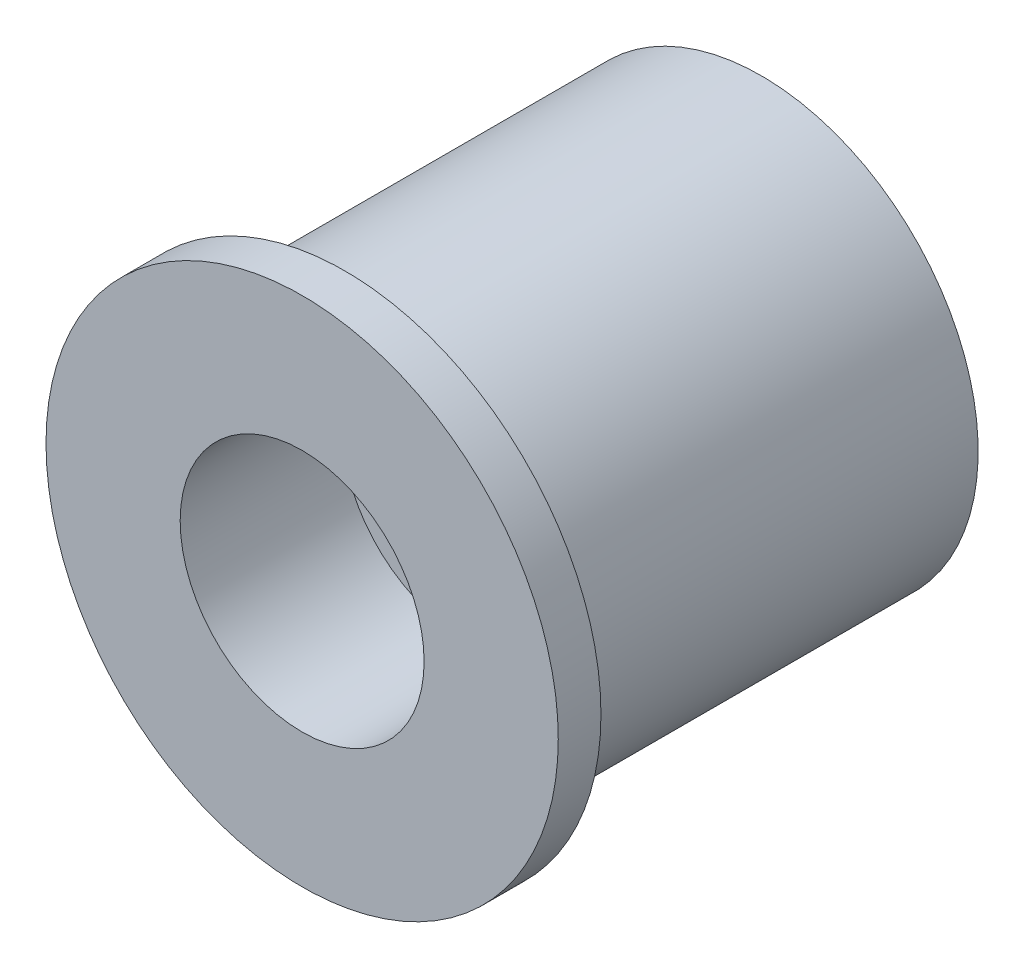
ISO-10303-21;
HEADER;
FILE_DESCRIPTION(('STEP AP214'),'2;1');
FILE_NAME('part.step','',(''),(''),'','','');
FILE_SCHEMA(('AUTOMOTIVE_DESIGN { 1 0 10303 214 1 1 1 1 }'));
ENDSEC;
DATA;
#1=APPLICATION_CONTEXT('core data for automotive mechanical design processes');
#2=APPLICATION_PROTOCOL_DEFINITION('international standard','automotive_design',2000,#1);
#3=PRODUCT_CONTEXT('',#1,'mechanical');
#4=PRODUCT('Part','Part','',(#3));
#5=PRODUCT_RELATED_PRODUCT_CATEGORY('part','',(#4));
#6=PRODUCT_DEFINITION_FORMATION('','',#4);
#7=PRODUCT_DEFINITION_CONTEXT('part definition',#1,'design');
#8=PRODUCT_DEFINITION('design','',#6,#7);
#9=PRODUCT_DEFINITION_SHAPE('','',#8);
#10=(LENGTH_UNIT() NAMED_UNIT(*) SI_UNIT(.MILLI.,.METRE.));
#11=(NAMED_UNIT(*) PLANE_ANGLE_UNIT() SI_UNIT($,.RADIAN.));
#12=(NAMED_UNIT(*) SI_UNIT($,.STERADIAN.) SOLID_ANGLE_UNIT());
#13=UNCERTAINTY_MEASURE_WITH_UNIT(LENGTH_MEASURE(1.E-05),#10,'distance_accuracy_value','');
#14=(GEOMETRIC_REPRESENTATION_CONTEXT(3) GLOBAL_UNCERTAINTY_ASSIGNED_CONTEXT((#13)) GLOBAL_UNIT_ASSIGNED_CONTEXT((#10,
#11,#12)) REPRESENTATION_CONTEXT('',''));
#15=CARTESIAN_POINT('',(0.,0.,0.));
#16=DIRECTION('',(0.,0.,1.));
#17=DIRECTION('',(1.,0.,0.));
#18=AXIS2_PLACEMENT_3D('',#15,#16,#17);
#19=CARTESIAN_POINT('',(9.46149975061417,9.46149975061417,15.367));
#20=DIRECTION('',(0.,0.,-1.));
#21=DIRECTION('',(-1.,0.,0.));
#22=AXIS2_PLACEMENT_3D('',#19,#20,#21);
#23=CYLINDRICAL_SURFACE('',#22,8.);
#24=CARTESIAN_POINT('',(9.46149975061417,9.46149975061417,15.367));
#25=DIRECTION('',(0.,0.,1.));
#26=DIRECTION('',(1.,0.,0.));
#27=AXIS2_PLACEMENT_3D('',#24,#25,#26);
#28=CIRCLE('',#27,8.);
#29=CARTESIAN_POINT('',(1.46149975061417,9.46149975061417,15.367));
#30=VERTEX_POINT('',#29);
#31=EDGE_CURVE('E10',#30,#30,#28,.T.);
#32=CARTESIAN_POINT('',(9.46149975061417,9.46149975061417,0.));
#33=DIRECTION('',(0.,0.,1.));
#34=DIRECTION('',(1.,0.,0.));
#35=AXIS2_PLACEMENT_3D('',#32,#33,#34);
#36=CIRCLE('',#35,8.);
#37=CARTESIAN_POINT('',(1.46149975061417,9.46149975061417,0.));
#38=VERTEX_POINT('',#37);
#39=EDGE_CURVE('E38',#38,#38,#36,.T.);
#40=CARTESIAN_POINT('',(1.46149975061417,9.46149975061417,15.367));
#41=CARTESIAN_POINT('',(1.46149975061417,9.46149975061417,15.2069270833333));
#42=CARTESIAN_POINT('',(1.46149975061417,9.46149975061417,15.0468541666667));
#43=CARTESIAN_POINT('',(1.46149975061417,9.46149975061417,14.7267083333333));
#44=CARTESIAN_POINT('',(1.46149975061417,9.46149975061417,14.5666354166667));
#45=CARTESIAN_POINT('',(1.46149975061417,9.46149975061417,14.2464895833333));
#46=CARTESIAN_POINT('',(1.46149975061417,9.46149975061417,14.0864166666667));
#47=CARTESIAN_POINT('',(1.46149975061417,9.46149975061417,13.7662708333333));
#48=CARTESIAN_POINT('',(1.46149975061417,9.46149975061417,13.6061979166667));
#49=CARTESIAN_POINT('',(1.46149975061417,9.46149975061417,13.2860520833333));
#50=CARTESIAN_POINT('',(1.46149975061417,9.46149975061417,13.1259791666667));
#51=CARTESIAN_POINT('',(1.46149975061417,9.46149975061417,12.8058333333333));
#52=CARTESIAN_POINT('',(1.46149975061417,9.46149975061417,12.6457604166667));
#53=CARTESIAN_POINT('',(1.46149975061417,9.46149975061417,12.3256145833333));
#54=CARTESIAN_POINT('',(1.46149975061417,9.46149975061417,12.1655416666667));
#55=CARTESIAN_POINT('',(1.46149975061417,9.46149975061417,11.8453958333333));
#56=CARTESIAN_POINT('',(1.46149975061417,9.46149975061417,11.6853229166667));
#57=CARTESIAN_POINT('',(1.46149975061417,9.46149975061417,11.3651770833333));
#58=CARTESIAN_POINT('',(1.46149975061417,9.46149975061417,11.2051041666667));
#59=CARTESIAN_POINT('',(1.46149975061417,9.46149975061417,10.8849583333333));
#60=CARTESIAN_POINT('',(1.46149975061417,9.46149975061417,10.7248854166667));
#61=CARTESIAN_POINT('',(1.46149975061417,9.46149975061417,10.4047395833333));
#62=CARTESIAN_POINT('',(1.46149975061417,9.46149975061417,10.2446666666667));
#63=CARTESIAN_POINT('',(1.46149975061417,9.46149975061417,9.92452083333333));
#64=CARTESIAN_POINT('',(1.46149975061417,9.46149975061417,9.76444791666667));
#65=CARTESIAN_POINT('',(1.46149975061417,9.46149975061417,9.44430208333333));
#66=CARTESIAN_POINT('',(1.46149975061417,9.46149975061417,9.28422916666667));
#67=CARTESIAN_POINT('',(1.46149975061417,9.46149975061417,8.96408333333333));
#68=CARTESIAN_POINT('',(1.46149975061417,9.46149975061417,8.80401041666667));
#69=CARTESIAN_POINT('',(1.46149975061417,9.46149975061417,8.48386458333333));
#70=CARTESIAN_POINT('',(1.46149975061417,9.46149975061417,8.32379166666667));
#71=CARTESIAN_POINT('',(1.46149975061417,9.46149975061417,8.00364583333333));
#72=CARTESIAN_POINT('',(1.46149975061417,9.46149975061417,7.84357291666667));
#73=CARTESIAN_POINT('',(1.46149975061417,9.46149975061417,7.52342708333333));
#74=CARTESIAN_POINT('',(1.46149975061417,9.46149975061417,7.36335416666667));
#75=CARTESIAN_POINT('',(1.46149975061417,9.46149975061417,7.04320833333333));
#76=CARTESIAN_POINT('',(1.46149975061417,9.46149975061417,6.88313541666667));
#77=CARTESIAN_POINT('',(1.46149975061417,9.46149975061417,6.56298958333333));
#78=CARTESIAN_POINT('',(1.46149975061417,9.46149975061417,6.40291666666667));
#79=CARTESIAN_POINT('',(1.46149975061417,9.46149975061417,6.08277083333333));
#80=CARTESIAN_POINT('',(1.46149975061417,9.46149975061417,5.92269791666667));
#81=CARTESIAN_POINT('',(1.46149975061417,9.46149975061417,5.60255208333333));
#82=CARTESIAN_POINT('',(1.46149975061417,9.46149975061417,5.44247916666667));
#83=CARTESIAN_POINT('',(1.46149975061417,9.46149975061417,5.12233333333333));
#84=CARTESIAN_POINT('',(1.46149975061417,9.46149975061417,4.96226041666667));
#85=CARTESIAN_POINT('',(1.46149975061417,9.46149975061417,4.64211458333333));
#86=CARTESIAN_POINT('',(1.46149975061417,9.46149975061417,4.48204166666667));
#87=CARTESIAN_POINT('',(1.46149975061417,9.46149975061417,4.16189583333333));
#88=CARTESIAN_POINT('',(1.46149975061417,9.46149975061417,4.00182291666667));
#89=CARTESIAN_POINT('',(1.46149975061417,9.46149975061417,3.68167708333333));
#90=CARTESIAN_POINT('',(1.46149975061417,9.46149975061417,3.52160416666667));
#91=CARTESIAN_POINT('',(1.46149975061417,9.46149975061417,3.20145833333333));
#92=CARTESIAN_POINT('',(1.46149975061417,9.46149975061417,3.04138541666667));
#93=CARTESIAN_POINT('',(1.46149975061417,9.46149975061417,2.72123958333333));
#94=CARTESIAN_POINT('',(1.46149975061417,9.46149975061417,2.56116666666667));
#95=CARTESIAN_POINT('',(1.46149975061417,9.46149975061417,2.24102083333333));
#96=CARTESIAN_POINT('',(1.46149975061417,9.46149975061417,2.08094791666667));
#97=CARTESIAN_POINT('',(1.46149975061417,9.46149975061417,1.76080208333333));
#98=CARTESIAN_POINT('',(1.46149975061417,9.46149975061417,1.60072916666667));
#99=CARTESIAN_POINT('',(1.46149975061417,9.46149975061417,1.28058333333333));
#100=CARTESIAN_POINT('',(1.46149975061417,9.46149975061417,1.12051041666667));
#101=CARTESIAN_POINT('',(1.46149975061417,9.46149975061417,0.800364583333333));
#102=CARTESIAN_POINT('',(1.46149975061417,9.46149975061417,0.640291666666667));
#103=CARTESIAN_POINT('',(1.46149975061417,9.46149975061417,0.320145833333334));
#104=CARTESIAN_POINT('',(1.46149975061417,9.46149975061417,0.160072916666667));
#105=CARTESIAN_POINT('',(1.46149975061417,9.46149975061417,0.));
#106=B_SPLINE_CURVE_WITH_KNOTS('',3,(#40,#41,#42,#43,#44,#45,#46,#47,#48,#49,#50,#51,#52,#53,
#54,#55,#56,#57,#58,#59,#60,#61,#62,#63,#64,#65,#66,#67,#68,#69,#70,#71,#72,#73,#74,#75,#76,#77,
#78,#79,#80,#81,#82,#83,#84,#85,#86,#87,#88,#89,#90,#91,#92,#93,#94,#95,#96,#97,#98,#99,#100,
#101,#102,#103,#104,#105),.UNSPECIFIED.,.F.,.F.,(4,2,2,2,2,2,2,2,2,2,2,2,2,2,2,2,2,2,2,2,2,2,2,
2,2,2,2,2,2,2,2,2,4),(0.,0.480218750000001,0.960437500000001,1.44065625,1.920875,2.40109375,
2.8813125,3.36153125,3.84175,4.32196875,4.8021875,5.28240625,5.762625,6.24284375,6.7230625,
7.20328125,7.6835,8.16371875,8.6439375,9.12415625,9.604375,10.08459375,10.5648125,11.04503125,
11.52525,12.00546875,12.4856875,12.96590625,13.446125,13.92634375,14.4065625,14.88678125,
15.367),.UNSPECIFIED.);
#107=EDGE_CURVE('BSEAM35',#30,#38,#106,.T.);
#108=ORIENTED_EDGE('',*,*,#31,.F.);
#109=ORIENTED_EDGE('',*,*,#39,.T.);
#110=ORIENTED_EDGE('',*,*,#107,.T.);
#111=ORIENTED_EDGE('',*,*,#107,.F.);
#112=EDGE_LOOP('',(#108,#110,#109,#111));
#113=FACE_BOUND('',#112,.T.);
#114=ADVANCED_FACE('F35',(#113),#23,.T.);
#115=CARTESIAN_POINT('',(9.46149975061417,9.46149975061417,0.));
#116=DIRECTION('',(0.,0.,1.));
#117=DIRECTION('',(1.,0.,0.));
#118=AXIS2_PLACEMENT_3D('',#115,#116,#117);
#119=PLANE('',#118);
#120=CARTESIAN_POINT('',(9.46149975061417,9.46149975061417,0.));
#121=DIRECTION('',(0.,0.,1.));
#122=DIRECTION('',(1.,0.,0.));
#123=AXIS2_PLACEMENT_3D('',#120,#121,#122);
#124=CIRCLE('',#123,2.1);
#125=CARTESIAN_POINT('',(11.5614997506142,9.46149975061417,0.));
#126=VERTEX_POINT('',#125);
#127=EDGE_CURVE('E45',#126,#126,#124,.T.);
#128=ORIENTED_EDGE('',*,*,#127,.T.);
#129=EDGE_LOOP('',(#128));
#130=FACE_BOUND('',#129,.T.);
#131=ORIENTED_EDGE('',*,*,#39,.F.);
#132=EDGE_LOOP('',(#131));
#133=FACE_BOUND('',#132,.T.);
#134=ADVANCED_FACE('F82',(#130,#133),#119,.F.);
#135=CARTESIAN_POINT('',(9.46149975061417,9.46149975061417,15.367));
#136=DIRECTION('',(0.,0.,1.));
#137=DIRECTION('',(1.,0.,0.));
#138=AXIS2_PLACEMENT_3D('',#135,#136,#137);
#139=CYLINDRICAL_SURFACE('',#138,2.1);
#140=ORIENTED_EDGE('',*,*,#127,.F.);
#141=EDGE_LOOP('',(#140));
#142=FACE_BOUND('',#141,.T.);
#143=CARTESIAN_POINT('',(9.46149975061417,9.46149975061417,10.967));
#144=DIRECTION('',(0.,0.,1.));
#145=DIRECTION('',(1.,0.,0.));
#146=AXIS2_PLACEMENT_3D('',#143,#144,#145);
#147=CIRCLE('',#146,2.1);
#148=CARTESIAN_POINT('',(11.5614997506142,9.46149975061417,10.967));
#149=VERTEX_POINT('',#148);
#150=EDGE_CURVE('E49',#149,#149,#147,.T.);
#151=ORIENTED_EDGE('',*,*,#150,.T.);
#152=EDGE_LOOP('',(#151));
#153=FACE_BOUND('',#152,.T.);
#154=ADVANCED_FACE('F87',(#142,#153),#139,.F.);
#155=CARTESIAN_POINT('',(11.5614997506142,9.46149975061417,10.967));
#156=DIRECTION('',(0.,0.,-1.));
#157=DIRECTION('',(-1.,0.,0.));
#158=AXIS2_PLACEMENT_3D('',#155,#156,#157);
#159=PLANE('',#158);
#160=ORIENTED_EDGE('',*,*,#150,.F.);
#161=EDGE_LOOP('',(#160));
#162=FACE_BOUND('',#161,.T.);
#163=CARTESIAN_POINT('',(9.46149975061417,9.46149975061417,10.967));
#164=DIRECTION('',(0.,0.,1.));
#165=DIRECTION('',(1.,0.,0.));
#166=AXIS2_PLACEMENT_3D('',#163,#164,#165);
#167=CIRCLE('',#166,4.5);
#168=CARTESIAN_POINT('',(13.9614997506142,9.46149975061417,10.967));
#169=VERTEX_POINT('',#168);
#170=EDGE_CURVE('E52',#169,#169,#167,.T.);
#171=ORIENTED_EDGE('',*,*,#170,.T.);
#172=EDGE_LOOP('',(#171));
#173=FACE_BOUND('',#172,.T.);
#174=ADVANCED_FACE('F78',(#162,#173),#159,.F.);
#175=CARTESIAN_POINT('',(9.46149975061417,9.46149975061417,15.367));
#176=DIRECTION('',(0.,0.,1.));
#177=DIRECTION('',(1.,0.,0.));
#178=AXIS2_PLACEMENT_3D('',#175,#176,#177);
#179=CYLINDRICAL_SURFACE('',#178,4.5);
#180=ORIENTED_EDGE('',*,*,#170,.F.);
#181=EDGE_LOOP('',(#180));
#182=FACE_BOUND('',#181,.T.);
#183=CARTESIAN_POINT('',(9.46149975061417,9.46149975061417,16.9418));
#184=DIRECTION('',(0.,0.,1.));
#185=DIRECTION('',(1.,0.,0.));
#186=AXIS2_PLACEMENT_3D('',#183,#184,#185);
#187=CIRCLE('',#186,4.5);
#188=CARTESIAN_POINT('',(13.9614997506142,9.46149975061417,16.9418));
#189=VERTEX_POINT('',#188);
#190=EDGE_CURVE('E59',#189,#189,#187,.T.);
#191=ORIENTED_EDGE('',*,*,#190,.T.);
#192=EDGE_LOOP('',(#191));
#193=FACE_BOUND('',#192,.T.);
#194=ADVANCED_FACE('F65',(#182,#193),#179,.F.);
#195=CARTESIAN_POINT('',(9.46149975061417,9.46149975061417,16.9418));
#196=DIRECTION('',(0.,0.,1.));
#197=DIRECTION('',(1.,0.,0.));
#198=AXIS2_PLACEMENT_3D('',#195,#196,#197);
#199=PLANE('',#198);
#200=CARTESIAN_POINT('',(9.46149975061417,9.46149975061417,16.9418));
#201=DIRECTION('',(0.,0.,1.));
#202=DIRECTION('',(1.,0.,0.));
#203=AXIS2_PLACEMENT_3D('',#200,#201,#202);
#204=CIRCLE('',#203,9.45);
#205=CARTESIAN_POINT('',(18.9114997506142,9.46149975061417,16.9418));
#206=VERTEX_POINT('',#205);
#207=EDGE_CURVE('E55',#206,#206,#204,.T.);
#208=ORIENTED_EDGE('',*,*,#207,.T.);
#209=EDGE_LOOP('',(#208));
#210=FACE_BOUND('',#209,.T.);
#211=ORIENTED_EDGE('',*,*,#190,.F.);
#212=EDGE_LOOP('',(#211));
#213=FACE_BOUND('',#212,.T.);
#214=ADVANCED_FACE('F67',(#210,#213),#199,.T.);
#215=CARTESIAN_POINT('',(9.46149975061417,9.46149975061417,15.367));
#216=DIRECTION('',(0.,0.,1.));
#217=DIRECTION('',(1.,0.,0.));
#218=AXIS2_PLACEMENT_3D('',#215,#216,#217);
#219=PLANE('',#218);
#220=ORIENTED_EDGE('',*,*,#31,.T.);
#221=EDGE_LOOP('',(#220));
#222=FACE_BOUND('',#221,.T.);
#223=CARTESIAN_POINT('',(9.46149975061417,9.46149975061417,15.367));
#224=DIRECTION('',(0.,0.,1.));
#225=DIRECTION('',(1.,0.,0.));
#226=AXIS2_PLACEMENT_3D('',#223,#224,#225);
#227=CIRCLE('',#226,9.45);
#228=CARTESIAN_POINT('',(18.9114997506142,9.46149975061417,15.367));
#229=VERTEX_POINT('',#228);
#230=EDGE_CURVE('E56',#229,#229,#227,.T.);
#231=ORIENTED_EDGE('',*,*,#230,.F.);
#232=EDGE_LOOP('',(#231));
#233=FACE_BOUND('',#232,.T.);
#234=ADVANCED_FACE('F69',(#222,#233),#219,.F.);
#235=CARTESIAN_POINT('',(9.46149975061417,9.46149975061417,16.9418));
#236=DIRECTION('',(0.,0.,-1.));
#237=DIRECTION('',(-1.,0.,0.));
#238=AXIS2_PLACEMENT_3D('',#235,#236,#237);
#239=CYLINDRICAL_SURFACE('',#238,9.45);
#240=ORIENTED_EDGE('',*,*,#207,.F.);
#241=EDGE_LOOP('',(#240));
#242=FACE_BOUND('',#241,.T.);
#243=ORIENTED_EDGE('',*,*,#230,.T.);
#244=EDGE_LOOP('',(#243));
#245=FACE_BOUND('',#244,.T.);
#246=ADVANCED_FACE('F76',(#242,#245),#239,.T.);
#247=CLOSED_SHELL('',(#114,#134,#154,#174,#194,#214,#234,#246));
#248=MANIFOLD_SOLID_BREP('B2',#247);
#249=ADVANCED_BREP_SHAPE_REPRESENTATION('',(#18,#248),#14);
#250=SHAPE_DEFINITION_REPRESENTATION(#9,#249);
ENDSEC;
END-ISO-10303-21;
